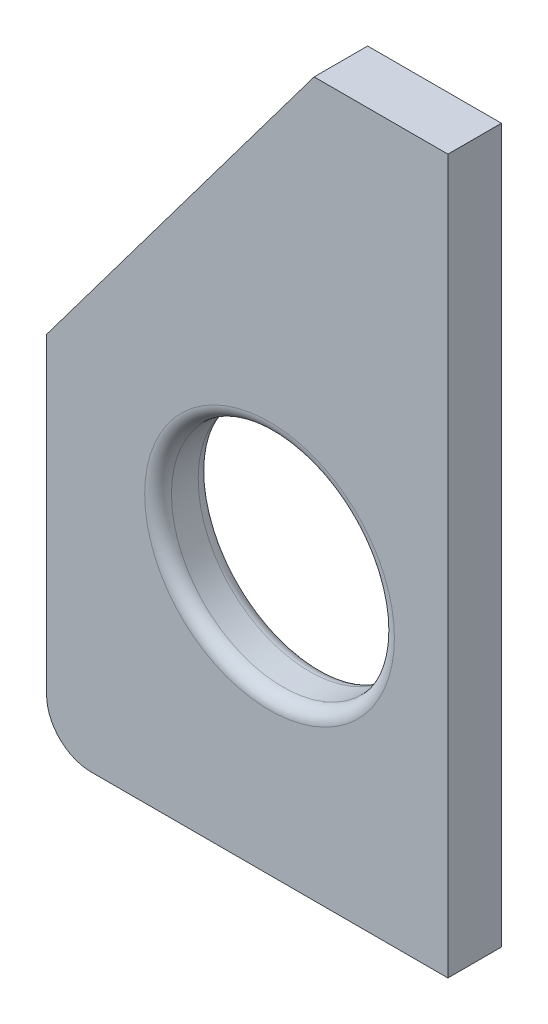
ISO-10303-21;
HEADER;
FILE_DESCRIPTION(('STEP AP214'),'2;1');
FILE_NAME('part.step','',(''),(''),'','','');
FILE_SCHEMA(('AUTOMOTIVE_DESIGN { 1 0 10303 214 1 1 1 1 }'));
ENDSEC;
DATA;
#1=APPLICATION_CONTEXT('core data for automotive mechanical design processes');
#2=APPLICATION_PROTOCOL_DEFINITION('international standard','automotive_design',2000,#1);
#3=PRODUCT_CONTEXT('',#1,'mechanical');
#4=PRODUCT('Part','Part','',(#3));
#5=PRODUCT_RELATED_PRODUCT_CATEGORY('part','',(#4));
#6=PRODUCT_DEFINITION_FORMATION('','',#4);
#7=PRODUCT_DEFINITION_CONTEXT('part definition',#1,'design');
#8=PRODUCT_DEFINITION('design','',#6,#7);
#9=PRODUCT_DEFINITION_SHAPE('','',#8);
#10=(LENGTH_UNIT() NAMED_UNIT(*) SI_UNIT(.MILLI.,.METRE.));
#11=(NAMED_UNIT(*) PLANE_ANGLE_UNIT() SI_UNIT($,.RADIAN.));
#12=(NAMED_UNIT(*) SI_UNIT($,.STERADIAN.) SOLID_ANGLE_UNIT());
#13=UNCERTAINTY_MEASURE_WITH_UNIT(LENGTH_MEASURE(1.E-05),#10,'distance_accuracy_value','');
#14=(GEOMETRIC_REPRESENTATION_CONTEXT(3) GLOBAL_UNCERTAINTY_ASSIGNED_CONTEXT((#13)) GLOBAL_UNIT_ASSIGNED_CONTEXT((#10,
#11,#12)) REPRESENTATION_CONTEXT('',''));
#15=CARTESIAN_POINT('',(0.,0.,0.));
#16=DIRECTION('',(0.,0.,1.));
#17=DIRECTION('',(1.,0.,0.));
#18=AXIS2_PLACEMENT_3D('',#15,#16,#17);
#19=CARTESIAN_POINT('',(0.,-160.,-12.));
#20=DIRECTION('',(1.,0.,0.));
#21=DIRECTION('',(0.,0.,-1.));
#22=AXIS2_PLACEMENT_3D('',#19,#20,#21);
#23=PLANE('',#22);
#24=DIRECTION('',(0.,1.,0.));
#25=VECTOR('',#24,1.);
#26=CARTESIAN_POINT('',(0.,-160.,0.));
#27=LINE('',#26,#25);
#28=CARTESIAN_POINT('',(0.,-160.,0.));
#29=VERTEX_POINT('',#28);
#30=CARTESIAN_POINT('',(0.,0.,0.));
#31=VERTEX_POINT('',#30);
#32=EDGE_CURVE('E126',#29,#31,#27,.T.);
#33=ORIENTED_EDGE('',*,*,#32,.F.);
#34=DIRECTION('',(0.,0.,1.));
#35=VECTOR('',#34,1.);
#36=CARTESIAN_POINT('',(0.,-160.,-12.));
#37=LINE('',#36,#35);
#38=CARTESIAN_POINT('',(0.,-160.,-12.));
#39=VERTEX_POINT('',#38);
#40=EDGE_CURVE('E55',#39,#29,#37,.T.);
#41=ORIENTED_EDGE('',*,*,#40,.F.);
#42=DIRECTION('',(0.,1.,0.));
#43=VECTOR('',#42,1.);
#44=CARTESIAN_POINT('',(0.,-160.,-12.));
#45=LINE('',#44,#43);
#46=CARTESIAN_POINT('',(0.,0.,-12.));
#47=VERTEX_POINT('',#46);
#48=EDGE_CURVE('E141',#39,#47,#45,.T.);
#49=ORIENTED_EDGE('',*,*,#48,.T.);
#50=DIRECTION('',(0.,0.,1.));
#51=VECTOR('',#50,1.);
#52=CARTESIAN_POINT('',(0.,0.,-12.));
#53=LINE('',#52,#51);
#54=EDGE_CURVE('E90',#47,#31,#53,.T.);
#55=ORIENTED_EDGE('',*,*,#54,.T.);
#56=EDGE_LOOP('',(#33,#41,#49,#55));
#57=FACE_BOUND('',#56,.T.);
#58=ADVANCED_FACE('F38',(#57),#23,.T.);
#59=CARTESIAN_POINT('',(0.,-160.,-12.));
#60=DIRECTION('',(0.,-1.,0.));
#61=DIRECTION('',(1.,0.,0.));
#62=AXIS2_PLACEMENT_3D('',#59,#60,#61);
#63=PLANE('',#62);
#64=DIRECTION('',(1.,0.,0.));
#65=VECTOR('',#64,1.);
#66=CARTESIAN_POINT('',(0.,-160.,0.));
#67=LINE('',#66,#65);
#68=CARTESIAN_POINT('',(-80.,-160.,0.));
#69=VERTEX_POINT('',#68);
#70=EDGE_CURVE('E138',#69,#29,#67,.T.);
#71=ORIENTED_EDGE('',*,*,#70,.F.);
#72=DIRECTION('',(0.,0.,1.));
#73=VECTOR('',#72,1.);
#74=CARTESIAN_POINT('',(-80.,-160.,-12.));
#75=LINE('',#74,#73);
#76=CARTESIAN_POINT('',(-80.,-160.,-12.));
#77=VERTEX_POINT('',#76);
#78=EDGE_CURVE('E78',#77,#69,#75,.T.);
#79=ORIENTED_EDGE('',*,*,#78,.F.);
#80=DIRECTION('',(1.,0.,0.));
#81=VECTOR('',#80,1.);
#82=CARTESIAN_POINT('',(0.,-160.,-12.));
#83=LINE('',#82,#81);
#84=EDGE_CURVE('E116',#77,#39,#83,.T.);
#85=ORIENTED_EDGE('',*,*,#84,.T.);
#86=ORIENTED_EDGE('',*,*,#40,.T.);
#87=EDGE_LOOP('',(#71,#79,#85,#86));
#88=FACE_BOUND('',#87,.T.);
#89=ADVANCED_FACE('F178',(#88),#63,.T.);
#90=CARTESIAN_POINT('',(-80.,-150.,-12.));
#91=DIRECTION('',(0.,0.,1.));
#92=DIRECTION('',(1.,0.,0.));
#93=AXIS2_PLACEMENT_3D('',#90,#91,#92);
#94=CYLINDRICAL_SURFACE('',#93,10.);
#95=CARTESIAN_POINT('',(-80.,-150.,0.));
#96=DIRECTION('',(0.,0.,1.));
#97=DIRECTION('',(1.,0.,0.));
#98=AXIS2_PLACEMENT_3D('',#95,#96,#97);
#99=CIRCLE('',#98,10.);
#100=CARTESIAN_POINT('',(-90.,-150.,0.));
#101=VERTEX_POINT('',#100);
#102=EDGE_CURVE('E103',#101,#69,#99,.T.);
#103=ORIENTED_EDGE('',*,*,#102,.F.);
#104=DIRECTION('',(0.,0.,1.));
#105=VECTOR('',#104,1.);
#106=CARTESIAN_POINT('',(-90.,-150.,-12.));
#107=LINE('',#106,#105);
#108=CARTESIAN_POINT('',(-90.,-150.,-12.));
#109=VERTEX_POINT('',#108);
#110=EDGE_CURVE('E98',#109,#101,#107,.T.);
#111=ORIENTED_EDGE('',*,*,#110,.F.);
#112=CARTESIAN_POINT('',(-80.,-150.,-12.));
#113=DIRECTION('',(0.,0.,1.));
#114=DIRECTION('',(1.,0.,0.));
#115=AXIS2_PLACEMENT_3D('',#112,#113,#114);
#116=CIRCLE('',#115,10.);
#117=EDGE_CURVE('E101',#109,#77,#116,.T.);
#118=ORIENTED_EDGE('',*,*,#117,.T.);
#119=ORIENTED_EDGE('',*,*,#78,.T.);
#120=EDGE_LOOP('',(#103,#111,#118,#119));
#121=FACE_BOUND('',#120,.T.);
#122=ADVANCED_FACE('F100',(#121),#94,.T.);
#123=CARTESIAN_POINT('',(-90.,-150.,-12.));
#124=DIRECTION('',(-1.,0.,0.));
#125=DIRECTION('',(0.,0.,1.));
#126=AXIS2_PLACEMENT_3D('',#123,#124,#125);
#127=PLANE('',#126);
#128=DIRECTION('',(0.,-1.,0.));
#129=VECTOR('',#128,1.);
#130=CARTESIAN_POINT('',(-90.,-150.,0.));
#131=LINE('',#130,#129);
#132=CARTESIAN_POINT('',(-90.,-80.,0.));
#133=VERTEX_POINT('',#132);
#134=EDGE_CURVE('E135',#133,#101,#131,.T.);
#135=ORIENTED_EDGE('',*,*,#134,.F.);
#136=DIRECTION('',(0.,0.,1.));
#137=VECTOR('',#136,1.);
#138=CARTESIAN_POINT('',(-90.,-80.,-12.));
#139=LINE('',#138,#137);
#140=CARTESIAN_POINT('',(-90.,-80.,-12.));
#141=VERTEX_POINT('',#140);
#142=EDGE_CURVE('E108',#141,#133,#139,.T.);
#143=ORIENTED_EDGE('',*,*,#142,.F.);
#144=DIRECTION('',(0.,-1.,0.));
#145=VECTOR('',#144,1.);
#146=CARTESIAN_POINT('',(-90.,-150.,-12.));
#147=LINE('',#146,#145);
#148=EDGE_CURVE('E114',#141,#109,#147,.T.);
#149=ORIENTED_EDGE('',*,*,#148,.T.);
#150=ORIENTED_EDGE('',*,*,#110,.T.);
#151=EDGE_LOOP('',(#135,#143,#149,#150));
#152=FACE_BOUND('',#151,.T.);
#153=ADVANCED_FACE('F118',(#152),#127,.T.);
#154=CARTESIAN_POINT('',(-29.9999999999999,0.,-12.));
#155=DIRECTION('',(-0.8,0.6,0.));
#156=DIRECTION('',(-0.6,-0.8,0.));
#157=AXIS2_PLACEMENT_3D('',#154,#155,#156);
#158=PLANE('',#157);
#159=DIRECTION('',(-0.6,-0.8,0.));
#160=VECTOR('',#159,1.);
#161=CARTESIAN_POINT('',(-29.9999999999999,0.,0.));
#162=LINE('',#161,#160);
#163=CARTESIAN_POINT('',(-29.9999999999999,0.,0.));
#164=VERTEX_POINT('',#163);
#165=EDGE_CURVE('E132',#164,#133,#162,.T.);
#166=ORIENTED_EDGE('',*,*,#165,.F.);
#167=DIRECTION('',(0.,0.,1.));
#168=VECTOR('',#167,1.);
#169=CARTESIAN_POINT('',(-29.9999999999999,0.,-12.));
#170=LINE('',#169,#168);
#171=CARTESIAN_POINT('',(-29.9999999999999,0.,-12.));
#172=VERTEX_POINT('',#171);
#173=EDGE_CURVE('E146',#172,#164,#170,.T.);
#174=ORIENTED_EDGE('',*,*,#173,.F.);
#175=DIRECTION('',(-0.6,-0.8,0.));
#176=VECTOR('',#175,1.);
#177=CARTESIAN_POINT('',(-29.9999999999999,0.,-12.));
#178=LINE('',#177,#176);
#179=EDGE_CURVE('E119',#172,#141,#178,.T.);
#180=ORIENTED_EDGE('',*,*,#179,.T.);
#181=ORIENTED_EDGE('',*,*,#142,.T.);
#182=EDGE_LOOP('',(#166,#174,#180,#181));
#183=FACE_BOUND('',#182,.T.);
#184=ADVANCED_FACE('F174',(#183),#158,.T.);
#185=CARTESIAN_POINT('',(0.,0.,-12.));
#186=DIRECTION('',(0.,1.,0.));
#187=DIRECTION('',(0.,0.,1.));
#188=AXIS2_PLACEMENT_3D('',#185,#186,#187);
#189=PLANE('',#188);
#190=DIRECTION('',(-1.,0.,0.));
#191=VECTOR('',#190,1.);
#192=CARTESIAN_POINT('',(0.,0.,0.));
#193=LINE('',#192,#191);
#194=EDGE_CURVE('E129',#31,#164,#193,.T.);
#195=ORIENTED_EDGE('',*,*,#194,.F.);
#196=ORIENTED_EDGE('',*,*,#54,.F.);
#197=DIRECTION('',(-1.,0.,0.));
#198=VECTOR('',#197,1.);
#199=CARTESIAN_POINT('',(0.,0.,-12.));
#200=LINE('',#199,#198);
#201=EDGE_CURVE('E121',#47,#172,#200,.T.);
#202=ORIENTED_EDGE('',*,*,#201,.T.);
#203=ORIENTED_EDGE('',*,*,#173,.T.);
#204=EDGE_LOOP('',(#195,#196,#202,#203));
#205=FACE_BOUND('',#204,.T.);
#206=ADVANCED_FACE('F166',(#205),#189,.T.);
#207=CARTESIAN_POINT('',(-80.,-150.,-12.));
#208=DIRECTION('',(0.,0.,1.));
#209=DIRECTION('',(1.,0.,0.));
#210=AXIS2_PLACEMENT_3D('',#207,#208,#209);
#211=PLANE('',#210);
#212=CARTESIAN_POINT('',(-40.,-100.,-12.));
#213=DIRECTION('',(0.,0.,1.));
#214=DIRECTION('',(1.,0.,0.));
#215=AXIS2_PLACEMENT_3D('',#212,#213,#214);
#216=CIRCLE('',#215,28.);
#217=CARTESIAN_POINT('',(-12.,-100.,-12.));
#218=VERTEX_POINT('',#217);
#219=EDGE_CURVE('E143',#218,#218,#216,.T.);
#220=ORIENTED_EDGE('',*,*,#219,.T.);
#221=EDGE_LOOP('',(#220));
#222=FACE_BOUND('',#221,.T.);
#223=ORIENTED_EDGE('',*,*,#48,.F.);
#224=ORIENTED_EDGE('',*,*,#84,.F.);
#225=ORIENTED_EDGE('',*,*,#117,.F.);
#226=ORIENTED_EDGE('',*,*,#148,.F.);
#227=ORIENTED_EDGE('',*,*,#179,.F.);
#228=ORIENTED_EDGE('',*,*,#201,.F.);
#229=EDGE_LOOP('',(#223,#224,#225,#226,#227,#228));
#230=FACE_BOUND('',#229,.T.);
#231=ADVANCED_FACE('F112',(#222,#230),#211,.F.);
#232=CARTESIAN_POINT('',(-80.,-150.,0.));
#233=DIRECTION('',(0.,0.,1.));
#234=DIRECTION('',(1.,0.,0.));
#235=AXIS2_PLACEMENT_3D('',#232,#233,#234);
#236=PLANE('',#235);
#237=CARTESIAN_POINT('',(-40.,-100.,0.));
#238=DIRECTION('',(0.,0.,1.));
#239=DIRECTION('',(1.,0.,0.));
#240=AXIS2_PLACEMENT_3D('',#237,#238,#239);
#241=CIRCLE('',#240,28.);
#242=CARTESIAN_POINT('',(-12.,-100.,0.));
#243=VERTEX_POINT('',#242);
#244=EDGE_CURVE('E11',#243,#243,#241,.F.);
#245=ORIENTED_EDGE('',*,*,#244,.T.);
#246=EDGE_LOOP('',(#245));
#247=FACE_BOUND('',#246,.T.);
#248=ORIENTED_EDGE('',*,*,#32,.T.);
#249=ORIENTED_EDGE('',*,*,#194,.T.);
#250=ORIENTED_EDGE('',*,*,#165,.T.);
#251=ORIENTED_EDGE('',*,*,#134,.T.);
#252=ORIENTED_EDGE('',*,*,#102,.T.);
#253=ORIENTED_EDGE('',*,*,#70,.T.);
#254=EDGE_LOOP('',(#248,#249,#250,#251,#252,#253));
#255=FACE_BOUND('',#254,.T.);
#256=ADVANCED_FACE('F165',(#247,#255),#236,.T.);
#257=CARTESIAN_POINT('',(-40.,-100.,-12.));
#258=DIRECTION('',(0.,0.,1.));
#259=DIRECTION('',(1.,0.,0.));
#260=AXIS2_PLACEMENT_3D('',#257,#258,#259);
#261=CYLINDRICAL_SURFACE('',#260,25.);
#262=CARTESIAN_POINT('',(-40.,-100.,-9.));
#263=DIRECTION('',(0.,0.,1.));
#264=DIRECTION('',(1.,0.,0.));
#265=AXIS2_PLACEMENT_3D('',#262,#263,#264);
#266=CIRCLE('',#265,25.);
#267=CARTESIAN_POINT('',(-15.,-100.,-9.));
#268=VERTEX_POINT('',#267);
#269=EDGE_CURVE('E47',#268,#268,#266,.F.);
#270=ORIENTED_EDGE('',*,*,#269,.T.);
#271=EDGE_LOOP('',(#270));
#272=FACE_BOUND('',#271,.T.);
#273=CARTESIAN_POINT('',(-40.,-100.,-3.));
#274=DIRECTION('',(0.,0.,1.));
#275=DIRECTION('',(1.,0.,0.));
#276=AXIS2_PLACEMENT_3D('',#273,#274,#275);
#277=CIRCLE('',#276,25.);
#278=CARTESIAN_POINT('',(-15.,-100.,-3.));
#279=VERTEX_POINT('',#278);
#280=EDGE_CURVE('E151',#279,#279,#277,.T.);
#281=ORIENTED_EDGE('',*,*,#280,.T.);
#282=EDGE_LOOP('',(#281));
#283=FACE_BOUND('',#282,.T.);
#284=ADVANCED_FACE('F156',(#272,#283),#261,.F.);
#285=CARTESIAN_POINT('',(-40.,-100.,-9.));
#286=DIRECTION('',(0.,0.,1.));
#287=DIRECTION('',(1.,0.,0.));
#288=AXIS2_PLACEMENT_3D('',#285,#286,#287);
#289=TOROIDAL_SURFACE('',#288,28.,3.);
#290=ORIENTED_EDGE('',*,*,#269,.F.);
#291=EDGE_LOOP('',(#290));
#292=FACE_BOUND('',#291,.T.);
#293=ORIENTED_EDGE('',*,*,#219,.F.);
#294=EDGE_LOOP('',(#293));
#295=FACE_BOUND('',#294,.T.);
#296=ADVANCED_FACE('F159',(#292,#295),#289,.T.);
#297=CARTESIAN_POINT('',(-40.,-100.,-3.));
#298=DIRECTION('',(0.,0.,1.));
#299=DIRECTION('',(1.,0.,0.));
#300=AXIS2_PLACEMENT_3D('',#297,#298,#299);
#301=TOROIDAL_SURFACE('',#300,28.,3.);
#302=ORIENTED_EDGE('',*,*,#244,.F.);
#303=EDGE_LOOP('',(#302));
#304=FACE_BOUND('',#303,.T.);
#305=ORIENTED_EDGE('',*,*,#280,.F.);
#306=EDGE_LOOP('',(#305));
#307=FACE_BOUND('',#306,.T.);
#308=ADVANCED_FACE('F40',(#304,#307),#301,.T.);
#309=CLOSED_SHELL('',(#58,#89,#122,#153,#184,#206,#231,#256,#284,#296,#308));
#310=MANIFOLD_SOLID_BREP('B2',#309);
#311=ADVANCED_BREP_SHAPE_REPRESENTATION('',(#18,#310),#14);
#312=SHAPE_DEFINITION_REPRESENTATION(#9,#311);
ENDSEC;
END-ISO-10303-21;
